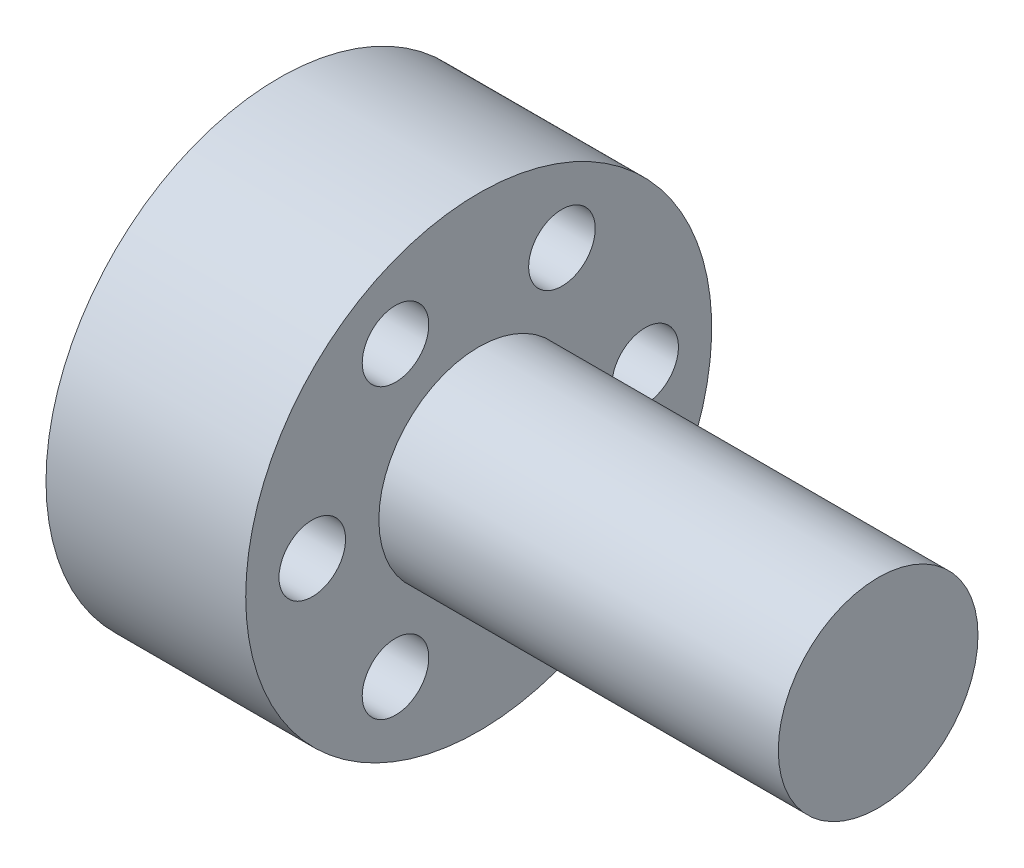
ISO-10303-21;
HEADER;
FILE_DESCRIPTION(('STEP AP214'),'2;1');
FILE_NAME('part.step','',(''),(''),'','','');
FILE_SCHEMA(('AUTOMOTIVE_DESIGN { 1 0 10303 214 1 1 1 1 }'));
ENDSEC;
DATA;
#1=APPLICATION_CONTEXT('core data for automotive mechanical design processes');
#2=APPLICATION_PROTOCOL_DEFINITION('international standard','automotive_design',2000,#1);
#3=PRODUCT_CONTEXT('',#1,'mechanical');
#4=PRODUCT('Part','Part','',(#3));
#5=PRODUCT_RELATED_PRODUCT_CATEGORY('part','',(#4));
#6=PRODUCT_DEFINITION_FORMATION('','',#4);
#7=PRODUCT_DEFINITION_CONTEXT('part definition',#1,'design');
#8=PRODUCT_DEFINITION('design','',#6,#7);
#9=PRODUCT_DEFINITION_SHAPE('','',#8);
#10=(LENGTH_UNIT() NAMED_UNIT(*) SI_UNIT(.MILLI.,.METRE.));
#11=(NAMED_UNIT(*) PLANE_ANGLE_UNIT() SI_UNIT($,.RADIAN.));
#12=(NAMED_UNIT(*) SI_UNIT($,.STERADIAN.) SOLID_ANGLE_UNIT());
#13=UNCERTAINTY_MEASURE_WITH_UNIT(LENGTH_MEASURE(1.E-05),#10,'distance_accuracy_value','');
#14=(GEOMETRIC_REPRESENTATION_CONTEXT(3) GLOBAL_UNCERTAINTY_ASSIGNED_CONTEXT((#13)) GLOBAL_UNIT_ASSIGNED_CONTEXT((#10,
#11,#12)) REPRESENTATION_CONTEXT('',''));
#15=CARTESIAN_POINT('',(0.,0.,0.));
#16=DIRECTION('',(0.,0.,1.));
#17=DIRECTION('',(1.,0.,0.));
#18=AXIS2_PLACEMENT_3D('',#15,#16,#17);
#19=CARTESIAN_POINT('',(0.,0.,0.));
#20=DIRECTION('',(1.,0.,0.));
#21=DIRECTION('',(0.,0.,-1.));
#22=AXIS2_PLACEMENT_3D('',#19,#20,#21);
#23=PLANE('',#22);
#24=CARTESIAN_POINT('',(0.,0.,0.));
#25=DIRECTION('',(-1.,0.,0.));
#26=DIRECTION('',(0.,0.,1.));
#27=AXIS2_PLACEMENT_3D('',#24,#25,#26);
#28=CIRCLE('',#27,20.);
#29=CARTESIAN_POINT('',(0.,0.,20.));
#30=VERTEX_POINT('',#29);
#31=EDGE_CURVE('E11',#30,#30,#28,.T.);
#32=ORIENTED_EDGE('',*,*,#31,.T.);
#33=EDGE_LOOP('',(#32));
#34=FACE_BOUND('',#33,.T.);
#35=ADVANCED_FACE('F39',(#34),#23,.F.);
#36=CARTESIAN_POINT('',(0.,0.,0.));
#37=DIRECTION('',(-1.,0.,0.));
#38=DIRECTION('',(0.,0.,1.));
#39=AXIS2_PLACEMENT_3D('',#36,#37,#38);
#40=CYLINDRICAL_SURFACE('',#39,20.);
#41=ORIENTED_EDGE('',*,*,#31,.F.);
#42=EDGE_LOOP('',(#41));
#43=FACE_BOUND('',#42,.T.);
#44=CARTESIAN_POINT('',(10.,0.,0.));
#45=DIRECTION('',(-1.,0.,0.));
#46=DIRECTION('',(0.,0.,1.));
#47=AXIS2_PLACEMENT_3D('',#44,#45,#46);
#48=CIRCLE('',#47,20.);
#49=CARTESIAN_POINT('',(9.99999999999999,0.,-20.));
#50=VERTEX_POINT('',#49);
#51=CARTESIAN_POINT('',(9.99999999999999,-17.3205080756888,-10.));
#52=VERTEX_POINT('',#51);
#53=EDGE_CURVE('E47',#50,#52,#48,.T.);
#54=ORIENTED_EDGE('',*,*,#53,.T.);
#55=CARTESIAN_POINT('',(9.99999999999999,-17.3205080756888,10.));
#56=VERTEX_POINT('',#55);
#57=EDGE_CURVE('E60',#52,#56,#48,.T.);
#58=ORIENTED_EDGE('',*,*,#57,.T.);
#59=CARTESIAN_POINT('',(9.99999999999999,0.,20.));
#60=VERTEX_POINT('',#59);
#61=EDGE_CURVE('E136',#56,#60,#48,.T.);
#62=ORIENTED_EDGE('',*,*,#61,.T.);
#63=CARTESIAN_POINT('',(9.99999999999999,17.3205080756888,9.99999999999999));
#64=VERTEX_POINT('',#63);
#65=EDGE_CURVE('E135',#60,#64,#48,.T.);
#66=ORIENTED_EDGE('',*,*,#65,.T.);
#67=CARTESIAN_POINT('',(9.99999999999999,17.3205080756888,-10.));
#68=VERTEX_POINT('',#67);
#69=EDGE_CURVE('E78',#64,#68,#48,.T.);
#70=ORIENTED_EDGE('',*,*,#69,.T.);
#71=EDGE_CURVE('E73',#68,#50,#48,.T.);
#72=ORIENTED_EDGE('',*,*,#71,.T.);
#73=EDGE_LOOP('',(#54,#58,#62,#66,#70,#72));
#74=FACE_BOUND('',#73,.T.);
#75=ADVANCED_FACE('F75',(#43,#74),#40,.T.);
#76=CARTESIAN_POINT('',(10.,20.,0.));
#77=DIRECTION('',(1.,0.,0.));
#78=DIRECTION('',(0.,0.,-1.));
#79=AXIS2_PLACEMENT_3D('',#76,#77,#78);
#80=PLANE('',#79);
#81=ORIENTED_EDGE('',*,*,#57,.F.);
#82=CARTESIAN_POINT('',(9.99999999999999,-21.650635094611,-12.5));
#83=DIRECTION('',(1.,0.,0.));
#84=DIRECTION('',(0.,0.,-1.));
#85=AXIS2_PLACEMENT_3D('',#82,#83,#84);
#86=CIRCLE('',#85,5.);
#87=EDGE_CURVE('E53',#52,#52,#86,.F.);
#88=ORIENTED_EDGE('',*,*,#87,.F.);
#89=ORIENTED_EDGE('',*,*,#53,.F.);
#90=CARTESIAN_POINT('',(9.99999999999999,0.,-25.));
#91=DIRECTION('',(1.,0.,0.));
#92=DIRECTION('',(0.,0.,-1.));
#93=AXIS2_PLACEMENT_3D('',#90,#91,#92);
#94=CIRCLE('',#93,5.);
#95=EDGE_CURVE('E86',#50,#50,#94,.F.);
#96=ORIENTED_EDGE('',*,*,#95,.F.);
#97=ORIENTED_EDGE('',*,*,#71,.F.);
#98=CARTESIAN_POINT('',(9.99999999999999,21.650635094611,-12.5));
#99=DIRECTION('',(1.,0.,0.));
#100=DIRECTION('',(0.,0.,-1.));
#101=AXIS2_PLACEMENT_3D('',#98,#99,#100);
#102=CIRCLE('',#101,5.);
#103=EDGE_CURVE('E95',#68,#68,#102,.F.);
#104=ORIENTED_EDGE('',*,*,#103,.F.);
#105=ORIENTED_EDGE('',*,*,#69,.F.);
#106=CARTESIAN_POINT('',(9.99999999999999,21.650635094611,12.5));
#107=DIRECTION('',(1.,0.,0.));
#108=DIRECTION('',(0.,0.,-1.));
#109=AXIS2_PLACEMENT_3D('',#106,#107,#108);
#110=CIRCLE('',#109,5.);
#111=EDGE_CURVE('E110',#64,#64,#110,.F.);
#112=ORIENTED_EDGE('',*,*,#111,.F.);
#113=ORIENTED_EDGE('',*,*,#65,.F.);
#114=CARTESIAN_POINT('',(9.99999999999999,0.,25.));
#115=DIRECTION('',(1.,0.,0.));
#116=DIRECTION('',(0.,0.,-1.));
#117=AXIS2_PLACEMENT_3D('',#114,#115,#116);
#118=CIRCLE('',#117,5.);
#119=EDGE_CURVE('E114',#60,#60,#118,.F.);
#120=ORIENTED_EDGE('',*,*,#119,.F.);
#121=ORIENTED_EDGE('',*,*,#61,.F.);
#122=CARTESIAN_POINT('',(9.99999999999999,-21.650635094611,12.5));
#123=DIRECTION('',(1.,0.,0.));
#124=DIRECTION('',(0.,0.,-1.));
#125=AXIS2_PLACEMENT_3D('',#122,#123,#124);
#126=CIRCLE('',#125,5.);
#127=EDGE_CURVE('E117',#56,#56,#126,.F.);
#128=ORIENTED_EDGE('',*,*,#127,.F.);
#129=EDGE_LOOP('',(#81,#88,#89,#96,#97,#104,#105,#112,#113,#120,#121,#128));
#130=FACE_BOUND('',#129,.T.);
#131=CARTESIAN_POINT('',(10.,0.,0.));
#132=DIRECTION('',(-1.,0.,0.));
#133=DIRECTION('',(0.,0.,1.));
#134=AXIS2_PLACEMENT_3D('',#131,#132,#133);
#135=CIRCLE('',#134,35.);
#136=CARTESIAN_POINT('',(10.,0.,35.));
#137=VERTEX_POINT('',#136);
#138=EDGE_CURVE('E83',#137,#137,#135,.T.);
#139=ORIENTED_EDGE('',*,*,#138,.T.);
#140=EDGE_LOOP('',(#139));
#141=FACE_BOUND('',#140,.T.);
#142=ADVANCED_FACE('F132',(#130,#141),#80,.F.);
#143=CARTESIAN_POINT('',(0.,0.,0.));
#144=DIRECTION('',(-1.,0.,0.));
#145=DIRECTION('',(0.,0.,1.));
#146=AXIS2_PLACEMENT_3D('',#143,#144,#145);
#147=CYLINDRICAL_SURFACE('',#146,35.);
#148=ORIENTED_EDGE('',*,*,#138,.F.);
#149=EDGE_LOOP('',(#148));
#150=FACE_BOUND('',#149,.T.);
#151=CARTESIAN_POINT('',(40.,0.,0.));
#152=DIRECTION('',(-1.,0.,0.));
#153=DIRECTION('',(0.,0.,1.));
#154=AXIS2_PLACEMENT_3D('',#151,#152,#153);
#155=CIRCLE('',#154,35.);
#156=CARTESIAN_POINT('',(40.,0.,35.));
#157=VERTEX_POINT('',#156);
#158=EDGE_CURVE('E102',#157,#157,#155,.T.);
#159=ORIENTED_EDGE('',*,*,#158,.T.);
#160=EDGE_LOOP('',(#159));
#161=FACE_BOUND('',#160,.T.);
#162=ADVANCED_FACE('F164',(#150,#161),#147,.T.);
#163=CARTESIAN_POINT('',(40.,35.,0.));
#164=DIRECTION('',(-1.,0.,0.));
#165=DIRECTION('',(0.,0.,1.));
#166=AXIS2_PLACEMENT_3D('',#163,#164,#165);
#167=PLANE('',#166);
#168=CARTESIAN_POINT('',(40.,-21.650635094611,-12.5));
#169=DIRECTION('',(-1.,0.,0.));
#170=DIRECTION('',(0.,0.,1.));
#171=AXIS2_PLACEMENT_3D('',#168,#169,#170);
#172=CIRCLE('',#171,5.);
#173=CARTESIAN_POINT('',(40.,-21.650635094611,-7.5));
#174=VERTEX_POINT('',#173);
#175=EDGE_CURVE('E42',#174,#174,#172,.F.);
#176=ORIENTED_EDGE('',*,*,#175,.F.);
#177=EDGE_LOOP('',(#176));
#178=FACE_BOUND('',#177,.T.);
#179=CARTESIAN_POINT('',(40.,-21.650635094611,12.5));
#180=DIRECTION('',(-1.,0.,0.));
#181=DIRECTION('',(0.,0.,1.));
#182=AXIS2_PLACEMENT_3D('',#179,#180,#181);
#183=CIRCLE('',#182,5.);
#184=CARTESIAN_POINT('',(40.,-21.650635094611,17.5));
#185=VERTEX_POINT('',#184);
#186=EDGE_CURVE('E118',#185,#185,#183,.F.);
#187=ORIENTED_EDGE('',*,*,#186,.F.);
#188=EDGE_LOOP('',(#187));
#189=FACE_BOUND('',#188,.T.);
#190=CARTESIAN_POINT('',(40.,0.,25.));
#191=DIRECTION('',(-1.,0.,0.));
#192=DIRECTION('',(0.,0.,1.));
#193=AXIS2_PLACEMENT_3D('',#190,#191,#192);
#194=CIRCLE('',#193,5.);
#195=CARTESIAN_POINT('',(40.,0.,30.));
#196=VERTEX_POINT('',#195);
#197=EDGE_CURVE('E115',#196,#196,#194,.F.);
#198=ORIENTED_EDGE('',*,*,#197,.F.);
#199=EDGE_LOOP('',(#198));
#200=FACE_BOUND('',#199,.T.);
#201=CARTESIAN_POINT('',(40.,21.650635094611,12.5));
#202=DIRECTION('',(-1.,0.,0.));
#203=DIRECTION('',(0.,0.,1.));
#204=AXIS2_PLACEMENT_3D('',#201,#202,#203);
#205=CIRCLE('',#204,5.);
#206=CARTESIAN_POINT('',(40.,21.650635094611,17.5));
#207=VERTEX_POINT('',#206);
#208=EDGE_CURVE('E111',#207,#207,#205,.F.);
#209=ORIENTED_EDGE('',*,*,#208,.F.);
#210=EDGE_LOOP('',(#209));
#211=FACE_BOUND('',#210,.T.);
#212=CARTESIAN_POINT('',(40.,21.650635094611,-12.5));
#213=DIRECTION('',(-1.,0.,0.));
#214=DIRECTION('',(0.,0.,1.));
#215=AXIS2_PLACEMENT_3D('',#212,#213,#214);
#216=CIRCLE('',#215,5.);
#217=CARTESIAN_POINT('',(40.,21.650635094611,-7.5));
#218=VERTEX_POINT('',#217);
#219=EDGE_CURVE('E107',#218,#218,#216,.F.);
#220=ORIENTED_EDGE('',*,*,#219,.F.);
#221=EDGE_LOOP('',(#220));
#222=FACE_BOUND('',#221,.T.);
#223=CARTESIAN_POINT('',(40.,0.,-25.));
#224=DIRECTION('',(-1.,0.,0.));
#225=DIRECTION('',(0.,0.,1.));
#226=AXIS2_PLACEMENT_3D('',#223,#224,#225);
#227=CIRCLE('',#226,5.);
#228=CARTESIAN_POINT('',(40.,0.,-20.));
#229=VERTEX_POINT('',#228);
#230=EDGE_CURVE('E89',#229,#229,#227,.F.);
#231=ORIENTED_EDGE('',*,*,#230,.F.);
#232=EDGE_LOOP('',(#231));
#233=FACE_BOUND('',#232,.T.);
#234=ORIENTED_EDGE('',*,*,#158,.F.);
#235=EDGE_LOOP('',(#234));
#236=FACE_BOUND('',#235,.T.);
#237=CARTESIAN_POINT('',(40.,0.,0.));
#238=DIRECTION('',(-1.,0.,0.));
#239=DIRECTION('',(0.,0.,1.));
#240=AXIS2_PLACEMENT_3D('',#237,#238,#239);
#241=CIRCLE('',#240,15.);
#242=CARTESIAN_POINT('',(40.,0.,15.));
#243=VERTEX_POINT('',#242);
#244=EDGE_CURVE('E92',#243,#243,#241,.T.);
#245=ORIENTED_EDGE('',*,*,#244,.T.);
#246=EDGE_LOOP('',(#245));
#247=FACE_BOUND('',#246,.T.);
#248=ADVANCED_FACE('F169',(#178,#189,#200,#211,#222,#233,#236,#247),#167,.F.);
#249=CARTESIAN_POINT('',(0.,0.,0.));
#250=DIRECTION('',(-1.,0.,0.));
#251=DIRECTION('',(0.,0.,1.));
#252=AXIS2_PLACEMENT_3D('',#249,#250,#251);
#253=CYLINDRICAL_SURFACE('',#252,15.);
#254=ORIENTED_EDGE('',*,*,#244,.F.);
#255=EDGE_LOOP('',(#254));
#256=FACE_BOUND('',#255,.T.);
#257=CARTESIAN_POINT('',(100.,0.,0.));
#258=DIRECTION('',(-1.,0.,0.));
#259=DIRECTION('',(0.,0.,1.));
#260=AXIS2_PLACEMENT_3D('',#257,#258,#259);
#261=CIRCLE('',#260,15.);
#262=CARTESIAN_POINT('',(100.,0.,15.));
#263=VERTEX_POINT('',#262);
#264=EDGE_CURVE('E88',#263,#263,#261,.T.);
#265=ORIENTED_EDGE('',*,*,#264,.T.);
#266=EDGE_LOOP('',(#265));
#267=FACE_BOUND('',#266,.T.);
#268=ADVANCED_FACE('F173',(#256,#267),#253,.T.);
#269=CARTESIAN_POINT('',(100.,0.,0.));
#270=DIRECTION('',(-1.,0.,0.));
#271=DIRECTION('',(0.,0.,1.));
#272=AXIS2_PLACEMENT_3D('',#269,#270,#271);
#273=PLANE('',#272);
#274=ORIENTED_EDGE('',*,*,#264,.F.);
#275=EDGE_LOOP('',(#274));
#276=FACE_BOUND('',#275,.T.);
#277=ADVANCED_FACE('F177',(#276),#273,.F.);
#278=CARTESIAN_POINT('',(100.,0.,-25.));
#279=DIRECTION('',(-1.,0.,0.));
#280=DIRECTION('',(0.,0.,1.));
#281=AXIS2_PLACEMENT_3D('',#278,#279,#280);
#282=CYLINDRICAL_SURFACE('',#281,5.);
#283=ORIENTED_EDGE('',*,*,#230,.T.);
#284=EDGE_LOOP('',(#283));
#285=FACE_BOUND('',#284,.T.);
#286=ORIENTED_EDGE('',*,*,#95,.T.);
#287=EDGE_LOOP('',(#286));
#288=FACE_BOUND('',#287,.T.);
#289=ADVANCED_FACE('F87',(#285,#288),#282,.F.);
#290=CARTESIAN_POINT('',(100.,21.650635094611,-12.5));
#291=DIRECTION('',(-1.,0.,0.));
#292=DIRECTION('',(0.,0.,1.));
#293=AXIS2_PLACEMENT_3D('',#290,#291,#292);
#294=CYLINDRICAL_SURFACE('',#293,5.);
#295=ORIENTED_EDGE('',*,*,#219,.T.);
#296=EDGE_LOOP('',(#295));
#297=FACE_BOUND('',#296,.T.);
#298=ORIENTED_EDGE('',*,*,#103,.T.);
#299=EDGE_LOOP('',(#298));
#300=FACE_BOUND('',#299,.T.);
#301=ADVANCED_FACE('F151',(#297,#300),#294,.F.);
#302=CARTESIAN_POINT('',(100.,21.650635094611,12.5));
#303=DIRECTION('',(-1.,0.,0.));
#304=DIRECTION('',(0.,0.,1.));
#305=AXIS2_PLACEMENT_3D('',#302,#303,#304);
#306=CYLINDRICAL_SURFACE('',#305,5.);
#307=ORIENTED_EDGE('',*,*,#208,.T.);
#308=EDGE_LOOP('',(#307));
#309=FACE_BOUND('',#308,.T.);
#310=ORIENTED_EDGE('',*,*,#111,.T.);
#311=EDGE_LOOP('',(#310));
#312=FACE_BOUND('',#311,.T.);
#313=ADVANCED_FACE('F130',(#309,#312),#306,.F.);
#314=CARTESIAN_POINT('',(100.,0.,25.));
#315=DIRECTION('',(-1.,0.,0.));
#316=DIRECTION('',(0.,0.,1.));
#317=AXIS2_PLACEMENT_3D('',#314,#315,#316);
#318=CYLINDRICAL_SURFACE('',#317,5.);
#319=ORIENTED_EDGE('',*,*,#197,.T.);
#320=EDGE_LOOP('',(#319));
#321=FACE_BOUND('',#320,.T.);
#322=ORIENTED_EDGE('',*,*,#119,.T.);
#323=EDGE_LOOP('',(#322));
#324=FACE_BOUND('',#323,.T.);
#325=ADVANCED_FACE('F140',(#321,#324),#318,.F.);
#326=CARTESIAN_POINT('',(100.,-21.650635094611,12.5));
#327=DIRECTION('',(-1.,0.,0.));
#328=DIRECTION('',(0.,0.,1.));
#329=AXIS2_PLACEMENT_3D('',#326,#327,#328);
#330=CYLINDRICAL_SURFACE('',#329,5.);
#331=ORIENTED_EDGE('',*,*,#186,.T.);
#332=EDGE_LOOP('',(#331));
#333=FACE_BOUND('',#332,.T.);
#334=ORIENTED_EDGE('',*,*,#127,.T.);
#335=EDGE_LOOP('',(#334));
#336=FACE_BOUND('',#335,.T.);
#337=ADVANCED_FACE('F142',(#333,#336),#330,.F.);
#338=CARTESIAN_POINT('',(100.,-21.650635094611,-12.5));
#339=DIRECTION('',(-1.,0.,0.));
#340=DIRECTION('',(0.,0.,1.));
#341=AXIS2_PLACEMENT_3D('',#338,#339,#340);
#342=CYLINDRICAL_SURFACE('',#341,5.);
#343=ORIENTED_EDGE('',*,*,#175,.T.);
#344=EDGE_LOOP('',(#343));
#345=FACE_BOUND('',#344,.T.);
#346=ORIENTED_EDGE('',*,*,#87,.T.);
#347=EDGE_LOOP('',(#346));
#348=FACE_BOUND('',#347,.T.);
#349=ADVANCED_FACE('F149',(#345,#348),#342,.F.);
#350=CLOSED_SHELL('',(#35,#75,#142,#162,#248,#268,#277,#289,#301,#313,#325,#337,#349));
#351=MANIFOLD_SOLID_BREP('B2',#350);
#352=ADVANCED_BREP_SHAPE_REPRESENTATION('',(#18,#351),#14);
#353=SHAPE_DEFINITION_REPRESENTATION(#9,#352);
ENDSEC;
END-ISO-10303-21;
